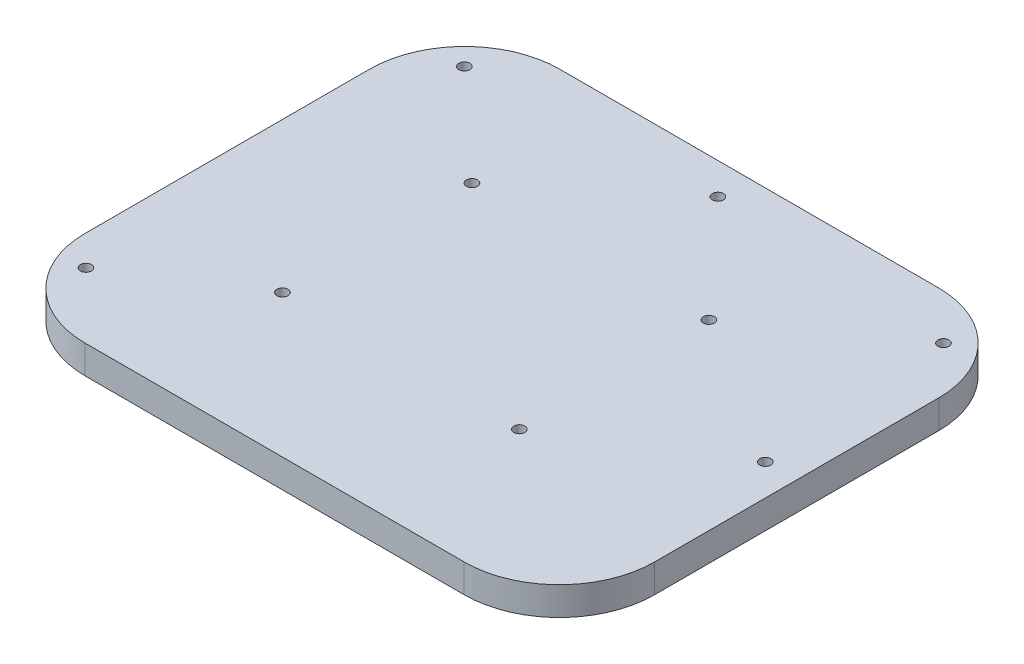
ISO-10303-21;
HEADER;
FILE_DESCRIPTION(('STEP AP214'),'2;1');
FILE_NAME('part.step','',(''),(''),'','','');
FILE_SCHEMA(('AUTOMOTIVE_DESIGN { 1 0 10303 214 1 1 1 1 }'));
ENDSEC;
DATA;
#1=APPLICATION_CONTEXT('core data for automotive mechanical design processes');
#2=APPLICATION_PROTOCOL_DEFINITION('international standard','automotive_design',2000,#1);
#3=PRODUCT_CONTEXT('',#1,'mechanical');
#4=PRODUCT('Part','Part','',(#3));
#5=PRODUCT_RELATED_PRODUCT_CATEGORY('part','',(#4));
#6=PRODUCT_DEFINITION_FORMATION('','',#4);
#7=PRODUCT_DEFINITION_CONTEXT('part definition',#1,'design');
#8=PRODUCT_DEFINITION('design','',#6,#7);
#9=PRODUCT_DEFINITION_SHAPE('','',#8);
#10=(LENGTH_UNIT() NAMED_UNIT(*) SI_UNIT(.MILLI.,.METRE.));
#11=(NAMED_UNIT(*) PLANE_ANGLE_UNIT() SI_UNIT($,.RADIAN.));
#12=(NAMED_UNIT(*) SI_UNIT($,.STERADIAN.) SOLID_ANGLE_UNIT());
#13=UNCERTAINTY_MEASURE_WITH_UNIT(LENGTH_MEASURE(1.E-05),#10,'distance_accuracy_value','');
#14=(GEOMETRIC_REPRESENTATION_CONTEXT(3) GLOBAL_UNCERTAINTY_ASSIGNED_CONTEXT((#13)) GLOBAL_UNIT_ASSIGNED_CONTEXT((#10,
#11,#12)) REPRESENTATION_CONTEXT('',''));
#15=CARTESIAN_POINT('',(0.,0.,0.));
#16=DIRECTION('',(0.,0.,1.));
#17=DIRECTION('',(1.,0.,0.));
#18=AXIS2_PLACEMENT_3D('',#15,#16,#17);
#19=CARTESIAN_POINT('',(-40.,6.,-30.));
#20=DIRECTION('',(0.,-1.,0.));
#21=DIRECTION('',(0.,0.,-1.));
#22=AXIS2_PLACEMENT_3D('',#19,#20,#21);
#23=CYLINDRICAL_SURFACE('',#22,20.08);
#24=CARTESIAN_POINT('',(-40.,0.,-30.));
#25=DIRECTION('',(0.,1.,0.));
#26=DIRECTION('',(0.,0.,1.));
#27=AXIS2_PLACEMENT_3D('',#24,#25,#26);
#28=CIRCLE('',#27,20.08);
#29=CARTESIAN_POINT('',(-40.,0.,-50.08));
#30=VERTEX_POINT('',#29);
#31=CARTESIAN_POINT('',(-60.08,0.,-30.));
#32=VERTEX_POINT('',#31);
#33=EDGE_CURVE('E135',#30,#32,#28,.T.);
#34=ORIENTED_EDGE('',*,*,#33,.T.);
#35=DIRECTION('',(0.,1.,0.));
#36=VECTOR('',#35,1.);
#37=CARTESIAN_POINT('',(-60.08,6.,-30.));
#38=LINE('',#37,#36);
#39=CARTESIAN_POINT('',(-60.08,6.,-30.));
#40=VERTEX_POINT('',#39);
#41=EDGE_CURVE('E12',#40,#32,#38,.F.);
#42=ORIENTED_EDGE('',*,*,#41,.F.);
#43=CARTESIAN_POINT('',(-40.,6.,-30.));
#44=DIRECTION('',(0.,1.,0.));
#45=DIRECTION('',(0.,0.,1.));
#46=AXIS2_PLACEMENT_3D('',#43,#44,#45);
#47=CIRCLE('',#46,20.08);
#48=CARTESIAN_POINT('',(-40.,6.,-50.08));
#49=VERTEX_POINT('',#48);
#50=EDGE_CURVE('E141',#49,#40,#47,.T.);
#51=ORIENTED_EDGE('',*,*,#50,.F.);
#52=DIRECTION('',(0.,-1.,0.));
#53=VECTOR('',#52,1.);
#54=CARTESIAN_POINT('',(-40.,6.,-50.08));
#55=LINE('',#54,#53);
#56=EDGE_CURVE('E149',#49,#30,#55,.T.);
#57=ORIENTED_EDGE('',*,*,#56,.T.);
#58=EDGE_LOOP('',(#34,#42,#51,#57));
#59=FACE_BOUND('',#58,.T.);
#60=ADVANCED_FACE('F33',(#59),#23,.T.);
#61=CARTESIAN_POINT('',(-60.08,6.,-30.));
#62=DIRECTION('',(1.,0.,0.));
#63=DIRECTION('',(0.,0.,-1.));
#64=AXIS2_PLACEMENT_3D('',#61,#62,#63);
#65=PLANE('',#64);
#66=DIRECTION('',(0.,0.,1.));
#67=VECTOR('',#66,1.);
#68=CARTESIAN_POINT('',(-60.08,0.,-30.));
#69=LINE('',#68,#67);
#70=CARTESIAN_POINT('',(-60.08,0.,30.));
#71=VERTEX_POINT('',#70);
#72=EDGE_CURVE('E133',#32,#71,#69,.T.);
#73=ORIENTED_EDGE('',*,*,#72,.T.);
#74=DIRECTION('',(0.,-1.,0.));
#75=VECTOR('',#74,1.);
#76=CARTESIAN_POINT('',(-60.08,6.,30.));
#77=LINE('',#76,#75);
#78=CARTESIAN_POINT('',(-60.08,6.,30.));
#79=VERTEX_POINT('',#78);
#80=EDGE_CURVE('E43',#79,#71,#77,.T.);
#81=ORIENTED_EDGE('',*,*,#80,.F.);
#82=DIRECTION('',(0.,0.,1.));
#83=VECTOR('',#82,1.);
#84=CARTESIAN_POINT('',(-60.08,6.,-30.));
#85=LINE('',#84,#83);
#86=EDGE_CURVE('E151',#40,#79,#85,.T.);
#87=ORIENTED_EDGE('',*,*,#86,.F.);
#88=ORIENTED_EDGE('',*,*,#41,.T.);
#89=EDGE_LOOP('',(#73,#81,#87,#88));
#90=FACE_BOUND('',#89,.T.);
#91=ADVANCED_FACE('F158',(#90),#65,.F.);
#92=CARTESIAN_POINT('',(-40.,6.,30.));
#93=DIRECTION('',(0.,-1.,0.));
#94=DIRECTION('',(0.,0.,-1.));
#95=AXIS2_PLACEMENT_3D('',#92,#93,#94);
#96=CYLINDRICAL_SURFACE('',#95,20.08);
#97=CARTESIAN_POINT('',(-40.,0.,30.));
#98=DIRECTION('',(0.,1.,0.));
#99=DIRECTION('',(0.,0.,1.));
#100=AXIS2_PLACEMENT_3D('',#97,#98,#99);
#101=CIRCLE('',#100,20.08);
#102=CARTESIAN_POINT('',(-40.,0.,50.08));
#103=VERTEX_POINT('',#102);
#104=EDGE_CURVE('E114',#71,#103,#101,.T.);
#105=ORIENTED_EDGE('',*,*,#104,.T.);
#106=DIRECTION('',(0.,1.,0.));
#107=VECTOR('',#106,1.);
#108=CARTESIAN_POINT('',(-40.,6.,50.08));
#109=LINE('',#108,#107);
#110=CARTESIAN_POINT('',(-40.,6.,50.08));
#111=VERTEX_POINT('',#110);
#112=EDGE_CURVE('E109',#111,#103,#109,.F.);
#113=ORIENTED_EDGE('',*,*,#112,.F.);
#114=CARTESIAN_POINT('',(-40.,6.,30.));
#115=DIRECTION('',(0.,1.,0.));
#116=DIRECTION('',(0.,0.,1.));
#117=AXIS2_PLACEMENT_3D('',#114,#115,#116);
#118=CIRCLE('',#117,20.08);
#119=EDGE_CURVE('E68',#79,#111,#118,.T.);
#120=ORIENTED_EDGE('',*,*,#119,.F.);
#121=ORIENTED_EDGE('',*,*,#80,.T.);
#122=EDGE_LOOP('',(#105,#113,#120,#121));
#123=FACE_BOUND('',#122,.T.);
#124=ADVANCED_FACE('F160',(#123),#96,.T.);
#125=CARTESIAN_POINT('',(-40.,6.,50.08));
#126=DIRECTION('',(0.,0.,-1.));
#127=DIRECTION('',(-1.,0.,0.));
#128=AXIS2_PLACEMENT_3D('',#125,#126,#127);
#129=PLANE('',#128);
#130=DIRECTION('',(1.,0.,0.));
#131=VECTOR('',#130,1.);
#132=CARTESIAN_POINT('',(-40.,0.,50.08));
#133=LINE('',#132,#131);
#134=CARTESIAN_POINT('',(40.,0.,50.08));
#135=VERTEX_POINT('',#134);
#136=EDGE_CURVE('E105',#103,#135,#133,.T.);
#137=ORIENTED_EDGE('',*,*,#136,.T.);
#138=DIRECTION('',(0.,-1.,0.));
#139=VECTOR('',#138,1.);
#140=CARTESIAN_POINT('',(40.,6.,50.08));
#141=LINE('',#140,#139);
#142=CARTESIAN_POINT('',(40.,6.,50.08));
#143=VERTEX_POINT('',#142);
#144=EDGE_CURVE('E108',#143,#135,#141,.T.);
#145=ORIENTED_EDGE('',*,*,#144,.F.);
#146=DIRECTION('',(1.,0.,0.));
#147=VECTOR('',#146,1.);
#148=CARTESIAN_POINT('',(-40.,6.,50.08));
#149=LINE('',#148,#147);
#150=EDGE_CURVE('E37',#111,#143,#149,.T.);
#151=ORIENTED_EDGE('',*,*,#150,.F.);
#152=ORIENTED_EDGE('',*,*,#112,.T.);
#153=EDGE_LOOP('',(#137,#145,#151,#152));
#154=FACE_BOUND('',#153,.T.);
#155=ADVANCED_FACE('F107',(#154),#129,.F.);
#156=CARTESIAN_POINT('',(40.,6.,30.));
#157=DIRECTION('',(0.,-1.,0.));
#158=DIRECTION('',(0.,0.,-1.));
#159=AXIS2_PLACEMENT_3D('',#156,#157,#158);
#160=CYLINDRICAL_SURFACE('',#159,20.08);
#161=CARTESIAN_POINT('',(40.,0.,30.));
#162=DIRECTION('',(0.,1.,0.));
#163=DIRECTION('',(0.,0.,1.));
#164=AXIS2_PLACEMENT_3D('',#161,#162,#163);
#165=CIRCLE('',#164,20.08);
#166=CARTESIAN_POINT('',(60.08,0.,30.));
#167=VERTEX_POINT('',#166);
#168=EDGE_CURVE('E113',#135,#167,#165,.T.);
#169=ORIENTED_EDGE('',*,*,#168,.T.);
#170=DIRECTION('',(0.,1.,0.));
#171=VECTOR('',#170,1.);
#172=CARTESIAN_POINT('',(60.08,6.,30.));
#173=LINE('',#172,#171);
#174=CARTESIAN_POINT('',(60.08,6.,30.));
#175=VERTEX_POINT('',#174);
#176=EDGE_CURVE('E119',#175,#167,#173,.F.);
#177=ORIENTED_EDGE('',*,*,#176,.F.);
#178=CARTESIAN_POINT('',(40.,6.,30.));
#179=DIRECTION('',(0.,1.,0.));
#180=DIRECTION('',(0.,0.,1.));
#181=AXIS2_PLACEMENT_3D('',#178,#179,#180);
#182=CIRCLE('',#181,20.08);
#183=EDGE_CURVE('E77',#143,#175,#182,.T.);
#184=ORIENTED_EDGE('',*,*,#183,.F.);
#185=ORIENTED_EDGE('',*,*,#144,.T.);
#186=EDGE_LOOP('',(#169,#177,#184,#185));
#187=FACE_BOUND('',#186,.T.);
#188=ADVANCED_FACE('F117',(#187),#160,.T.);
#189=CARTESIAN_POINT('',(60.08,6.,-30.));
#190=DIRECTION('',(-1.,0.,0.));
#191=DIRECTION('',(0.,0.,1.));
#192=AXIS2_PLACEMENT_3D('',#189,#190,#191);
#193=PLANE('',#192);
#194=DIRECTION('',(0.,0.,-1.));
#195=VECTOR('',#194,1.);
#196=CARTESIAN_POINT('',(60.08,0.,-30.));
#197=LINE('',#196,#195);
#198=CARTESIAN_POINT('',(60.08,0.,-30.));
#199=VERTEX_POINT('',#198);
#200=EDGE_CURVE('E125',#167,#199,#197,.T.);
#201=ORIENTED_EDGE('',*,*,#200,.T.);
#202=DIRECTION('',(0.,-1.,0.));
#203=VECTOR('',#202,1.);
#204=CARTESIAN_POINT('',(60.08,6.,-30.));
#205=LINE('',#204,#203);
#206=CARTESIAN_POINT('',(60.08,6.,-30.));
#207=VERTEX_POINT('',#206);
#208=EDGE_CURVE('E168',#207,#199,#205,.T.);
#209=ORIENTED_EDGE('',*,*,#208,.F.);
#210=DIRECTION('',(0.,0.,-1.));
#211=VECTOR('',#210,1.);
#212=CARTESIAN_POINT('',(60.08,6.,-30.));
#213=LINE('',#212,#211);
#214=EDGE_CURVE('E144',#175,#207,#213,.T.);
#215=ORIENTED_EDGE('',*,*,#214,.F.);
#216=ORIENTED_EDGE('',*,*,#176,.T.);
#217=EDGE_LOOP('',(#201,#209,#215,#216));
#218=FACE_BOUND('',#217,.T.);
#219=ADVANCED_FACE('F285',(#218),#193,.F.);
#220=CARTESIAN_POINT('',(40.,6.,-30.));
#221=DIRECTION('',(0.,-1.,0.));
#222=DIRECTION('',(0.,0.,-1.));
#223=AXIS2_PLACEMENT_3D('',#220,#221,#222);
#224=CYLINDRICAL_SURFACE('',#223,20.08);
#225=CARTESIAN_POINT('',(40.,0.,-30.));
#226=DIRECTION('',(0.,1.,0.));
#227=DIRECTION('',(0.,0.,1.));
#228=AXIS2_PLACEMENT_3D('',#225,#226,#227);
#229=CIRCLE('',#228,20.08);
#230=CARTESIAN_POINT('',(40.,0.,-50.08));
#231=VERTEX_POINT('',#230);
#232=EDGE_CURVE('E127',#199,#231,#229,.T.);
#233=ORIENTED_EDGE('',*,*,#232,.T.);
#234=DIRECTION('',(0.,1.,0.));
#235=VECTOR('',#234,1.);
#236=CARTESIAN_POINT('',(40.,6.,-50.08));
#237=LINE('',#236,#235);
#238=CARTESIAN_POINT('',(40.,6.,-50.08));
#239=VERTEX_POINT('',#238);
#240=EDGE_CURVE('E165',#239,#231,#237,.F.);
#241=ORIENTED_EDGE('',*,*,#240,.F.);
#242=CARTESIAN_POINT('',(40.,6.,-30.));
#243=DIRECTION('',(0.,1.,0.));
#244=DIRECTION('',(0.,0.,1.));
#245=AXIS2_PLACEMENT_3D('',#242,#243,#244);
#246=CIRCLE('',#245,20.08);
#247=EDGE_CURVE('E146',#207,#239,#246,.T.);
#248=ORIENTED_EDGE('',*,*,#247,.F.);
#249=ORIENTED_EDGE('',*,*,#208,.T.);
#250=EDGE_LOOP('',(#233,#241,#248,#249));
#251=FACE_BOUND('',#250,.T.);
#252=ADVANCED_FACE('F290',(#251),#224,.T.);
#253=CARTESIAN_POINT('',(-40.,6.,-50.08));
#254=DIRECTION('',(0.,0.,1.));
#255=DIRECTION('',(1.,0.,0.));
#256=AXIS2_PLACEMENT_3D('',#253,#254,#255);
#257=PLANE('',#256);
#258=DIRECTION('',(-1.,0.,0.));
#259=VECTOR('',#258,1.);
#260=CARTESIAN_POINT('',(-40.,0.,-50.08));
#261=LINE('',#260,#259);
#262=EDGE_CURVE('E139',#231,#30,#261,.T.);
#263=ORIENTED_EDGE('',*,*,#262,.T.);
#264=ORIENTED_EDGE('',*,*,#56,.F.);
#265=DIRECTION('',(-1.,0.,0.));
#266=VECTOR('',#265,1.);
#267=CARTESIAN_POINT('',(-40.,6.,-50.08));
#268=LINE('',#267,#266);
#269=EDGE_CURVE('E52',#239,#49,#268,.T.);
#270=ORIENTED_EDGE('',*,*,#269,.F.);
#271=ORIENTED_EDGE('',*,*,#240,.T.);
#272=EDGE_LOOP('',(#263,#264,#270,#271));
#273=FACE_BOUND('',#272,.T.);
#274=ADVANCED_FACE('F238',(#273),#257,.F.);
#275=CARTESIAN_POINT('',(-40.,6.,-30.));
#276=DIRECTION('',(0.,1.,0.));
#277=DIRECTION('',(0.,0.,1.));
#278=AXIS2_PLACEMENT_3D('',#275,#276,#277);
#279=PLANE('',#278);
#280=CARTESIAN_POINT('',(21.55,6.,20.));
#281=DIRECTION('',(0.,1.,0.));
#282=DIRECTION('',(0.,0.,1.));
#283=AXIS2_PLACEMENT_3D('',#280,#281,#282);
#284=CIRCLE('',#283,1.17);
#285=CARTESIAN_POINT('',(21.55,6.,21.17));
#286=VERTEX_POINT('',#285);
#287=EDGE_CURVE('E222',#286,#286,#284,.T.);
#288=ORIENTED_EDGE('',*,*,#287,.F.);
#289=EDGE_LOOP('',(#288));
#290=FACE_BOUND('',#289,.T.);
#291=CARTESIAN_POINT('',(-28.45,6.,20.));
#292=DIRECTION('',(0.,1.,0.));
#293=DIRECTION('',(0.,0.,1.));
#294=AXIS2_PLACEMENT_3D('',#291,#292,#293);
#295=CIRCLE('',#294,1.17);
#296=CARTESIAN_POINT('',(-28.45,6.,21.17));
#297=VERTEX_POINT('',#296);
#298=EDGE_CURVE('E216',#297,#297,#295,.T.);
#299=ORIENTED_EDGE('',*,*,#298,.F.);
#300=EDGE_LOOP('',(#299));
#301=FACE_BOUND('',#300,.T.);
#302=CARTESIAN_POINT('',(21.55,6.,-20.));
#303=DIRECTION('',(0.,1.,0.));
#304=DIRECTION('',(0.,0.,1.));
#305=AXIS2_PLACEMENT_3D('',#302,#303,#304);
#306=CIRCLE('',#305,1.17);
#307=CARTESIAN_POINT('',(21.55,6.,-18.83));
#308=VERTEX_POINT('',#307);
#309=EDGE_CURVE('E210',#308,#308,#306,.T.);
#310=ORIENTED_EDGE('',*,*,#309,.F.);
#311=EDGE_LOOP('',(#310));
#312=FACE_BOUND('',#311,.T.);
#313=CARTESIAN_POINT('',(-28.45,6.,-20.));
#314=DIRECTION('',(0.,1.,0.));
#315=DIRECTION('',(0.,0.,1.));
#316=AXIS2_PLACEMENT_3D('',#313,#314,#315);
#317=CIRCLE('',#316,1.17);
#318=CARTESIAN_POINT('',(-28.45,6.,-18.83));
#319=VERTEX_POINT('',#318);
#320=EDGE_CURVE('E204',#319,#319,#317,.T.);
#321=ORIENTED_EDGE('',*,*,#320,.F.);
#322=EDGE_LOOP('',(#321));
#323=FACE_BOUND('',#322,.T.);
#324=CARTESIAN_POINT('',(-53.7092926056018,6.,36.2273752960606));
#325=DIRECTION('',(0.,1.,0.));
#326=DIRECTION('',(0.,0.,1.));
#327=AXIS2_PLACEMENT_3D('',#324,#325,#326);
#328=CIRCLE('',#327,1.17);
#329=CARTESIAN_POINT('',(-53.7092926056018,6.,37.3973752960606));
#330=VERTEX_POINT('',#329);
#331=EDGE_CURVE('E198',#330,#330,#328,.T.);
#332=ORIENTED_EDGE('',*,*,#331,.F.);
#333=EDGE_LOOP('',(#332));
#334=FACE_BOUND('',#333,.T.);
#335=CARTESIAN_POINT('',(-50.5585567633134,6.,-40.5085567633135));
#336=DIRECTION('',(0.,1.,0.));
#337=DIRECTION('',(0.,0.,1.));
#338=AXIS2_PLACEMENT_3D('',#335,#336,#337);
#339=CIRCLE('',#338,1.17);
#340=CARTESIAN_POINT('',(-50.5585567633134,6.,-39.3385567633135));
#341=VERTEX_POINT('',#340);
#342=EDGE_CURVE('E192',#341,#341,#339,.T.);
#343=ORIENTED_EDGE('',*,*,#342,.F.);
#344=EDGE_LOOP('',(#343));
#345=FACE_BOUND('',#344,.T.);
#346=CARTESIAN_POINT('',(50.5602719269526,6.,-40.5064159820192));
#347=DIRECTION('',(0.,1.,0.));
#348=DIRECTION('',(0.,0.,1.));
#349=AXIS2_PLACEMENT_3D('',#346,#347,#348);
#350=CIRCLE('',#349,1.17);
#351=CARTESIAN_POINT('',(50.5602719269526,6.,-39.3364159820192));
#352=VERTEX_POINT('',#351);
#353=EDGE_CURVE('E186',#352,#352,#350,.T.);
#354=ORIENTED_EDGE('',*,*,#353,.F.);
#355=EDGE_LOOP('',(#354));
#356=FACE_BOUND('',#355,.T.);
#357=CARTESIAN_POINT('',(0.,6.,-43.45));
#358=DIRECTION('',(0.,1.,0.));
#359=DIRECTION('',(0.,0.,1.));
#360=AXIS2_PLACEMENT_3D('',#357,#358,#359);
#361=CIRCLE('',#360,1.17);
#362=CARTESIAN_POINT('',(0.,6.,-42.28));
#363=VERTEX_POINT('',#362);
#364=EDGE_CURVE('E180',#363,#363,#361,.T.);
#365=ORIENTED_EDGE('',*,*,#364,.F.);
#366=EDGE_LOOP('',(#365));
#367=FACE_BOUND('',#366,.T.);
#368=CARTESIAN_POINT('',(53.475,6.,0.));
#369=DIRECTION('',(0.,1.,0.));
#370=DIRECTION('',(0.,0.,1.));
#371=AXIS2_PLACEMENT_3D('',#368,#369,#370);
#372=CIRCLE('',#371,1.17);
#373=CARTESIAN_POINT('',(53.475,6.,1.17));
#374=VERTEX_POINT('',#373);
#375=EDGE_CURVE('E174',#374,#374,#372,.T.);
#376=ORIENTED_EDGE('',*,*,#375,.F.);
#377=EDGE_LOOP('',(#376));
#378=FACE_BOUND('',#377,.T.);
#379=ORIENTED_EDGE('',*,*,#50,.T.);
#380=ORIENTED_EDGE('',*,*,#86,.T.);
#381=ORIENTED_EDGE('',*,*,#119,.T.);
#382=ORIENTED_EDGE('',*,*,#150,.T.);
#383=ORIENTED_EDGE('',*,*,#183,.T.);
#384=ORIENTED_EDGE('',*,*,#214,.T.);
#385=ORIENTED_EDGE('',*,*,#247,.T.);
#386=ORIENTED_EDGE('',*,*,#269,.T.);
#387=EDGE_LOOP('',(#379,#380,#381,#382,#383,#384,#385,#386));
#388=FACE_BOUND('',#387,.T.);
#389=ADVANCED_FACE('F153',(#290,#301,#312,#323,#334,#345,#356,#367,#378,#388),#279,.T.);
#390=CARTESIAN_POINT('',(-40.,0.,-30.));
#391=DIRECTION('',(0.,1.,0.));
#392=DIRECTION('',(0.,0.,1.));
#393=AXIS2_PLACEMENT_3D('',#390,#391,#392);
#394=PLANE('',#393);
#395=CARTESIAN_POINT('',(21.55,0.,20.));
#396=DIRECTION('',(0.,1.,0.));
#397=DIRECTION('',(0.,0.,1.));
#398=AXIS2_PLACEMENT_3D('',#395,#396,#397);
#399=CIRCLE('',#398,1.17);
#400=CARTESIAN_POINT('',(21.55,0.,21.17));
#401=VERTEX_POINT('',#400);
#402=EDGE_CURVE('E219',#401,#401,#399,.T.);
#403=ORIENTED_EDGE('',*,*,#402,.T.);
#404=EDGE_LOOP('',(#403));
#405=FACE_BOUND('',#404,.T.);
#406=CARTESIAN_POINT('',(-28.45,0.,20.));
#407=DIRECTION('',(0.,1.,0.));
#408=DIRECTION('',(0.,0.,1.));
#409=AXIS2_PLACEMENT_3D('',#406,#407,#408);
#410=CIRCLE('',#409,1.17);
#411=CARTESIAN_POINT('',(-28.45,0.,21.17));
#412=VERTEX_POINT('',#411);
#413=EDGE_CURVE('E213',#412,#412,#410,.T.);
#414=ORIENTED_EDGE('',*,*,#413,.T.);
#415=EDGE_LOOP('',(#414));
#416=FACE_BOUND('',#415,.T.);
#417=CARTESIAN_POINT('',(21.55,0.,-20.));
#418=DIRECTION('',(0.,1.,0.));
#419=DIRECTION('',(0.,0.,1.));
#420=AXIS2_PLACEMENT_3D('',#417,#418,#419);
#421=CIRCLE('',#420,1.17);
#422=CARTESIAN_POINT('',(21.55,0.,-18.83));
#423=VERTEX_POINT('',#422);
#424=EDGE_CURVE('E207',#423,#423,#421,.T.);
#425=ORIENTED_EDGE('',*,*,#424,.T.);
#426=EDGE_LOOP('',(#425));
#427=FACE_BOUND('',#426,.T.);
#428=CARTESIAN_POINT('',(-28.45,0.,-20.));
#429=DIRECTION('',(0.,1.,0.));
#430=DIRECTION('',(0.,0.,1.));
#431=AXIS2_PLACEMENT_3D('',#428,#429,#430);
#432=CIRCLE('',#431,1.17);
#433=CARTESIAN_POINT('',(-28.45,0.,-18.83));
#434=VERTEX_POINT('',#433);
#435=EDGE_CURVE('E201',#434,#434,#432,.T.);
#436=ORIENTED_EDGE('',*,*,#435,.T.);
#437=EDGE_LOOP('',(#436));
#438=FACE_BOUND('',#437,.T.);
#439=CARTESIAN_POINT('',(-53.7092926056018,0.,36.2273752960606));
#440=DIRECTION('',(0.,1.,0.));
#441=DIRECTION('',(0.,0.,1.));
#442=AXIS2_PLACEMENT_3D('',#439,#440,#441);
#443=CIRCLE('',#442,1.17);
#444=CARTESIAN_POINT('',(-53.7092926056018,0.,37.3973752960606));
#445=VERTEX_POINT('',#444);
#446=EDGE_CURVE('E195',#445,#445,#443,.T.);
#447=ORIENTED_EDGE('',*,*,#446,.T.);
#448=EDGE_LOOP('',(#447));
#449=FACE_BOUND('',#448,.T.);
#450=CARTESIAN_POINT('',(-50.5585567633134,0.,-40.5085567633135));
#451=DIRECTION('',(0.,1.,0.));
#452=DIRECTION('',(0.,0.,1.));
#453=AXIS2_PLACEMENT_3D('',#450,#451,#452);
#454=CIRCLE('',#453,1.17);
#455=CARTESIAN_POINT('',(-50.5585567633134,0.,-39.3385567633135));
#456=VERTEX_POINT('',#455);
#457=EDGE_CURVE('E189',#456,#456,#454,.T.);
#458=ORIENTED_EDGE('',*,*,#457,.T.);
#459=EDGE_LOOP('',(#458));
#460=FACE_BOUND('',#459,.T.);
#461=CARTESIAN_POINT('',(50.5602719269526,0.,-40.5064159820192));
#462=DIRECTION('',(0.,1.,0.));
#463=DIRECTION('',(0.,0.,1.));
#464=AXIS2_PLACEMENT_3D('',#461,#462,#463);
#465=CIRCLE('',#464,1.17);
#466=CARTESIAN_POINT('',(50.5602719269526,0.,-39.3364159820192));
#467=VERTEX_POINT('',#466);
#468=EDGE_CURVE('E183',#467,#467,#465,.T.);
#469=ORIENTED_EDGE('',*,*,#468,.T.);
#470=EDGE_LOOP('',(#469));
#471=FACE_BOUND('',#470,.T.);
#472=CARTESIAN_POINT('',(0.,0.,-43.45));
#473=DIRECTION('',(0.,1.,0.));
#474=DIRECTION('',(0.,0.,1.));
#475=AXIS2_PLACEMENT_3D('',#472,#473,#474);
#476=CIRCLE('',#475,1.17);
#477=CARTESIAN_POINT('',(0.,0.,-42.28));
#478=VERTEX_POINT('',#477);
#479=EDGE_CURVE('E177',#478,#478,#476,.T.);
#480=ORIENTED_EDGE('',*,*,#479,.T.);
#481=EDGE_LOOP('',(#480));
#482=FACE_BOUND('',#481,.T.);
#483=CARTESIAN_POINT('',(53.475,0.,0.));
#484=DIRECTION('',(0.,1.,0.));
#485=DIRECTION('',(0.,0.,1.));
#486=AXIS2_PLACEMENT_3D('',#483,#484,#485);
#487=CIRCLE('',#486,1.17);
#488=CARTESIAN_POINT('',(53.475,0.,1.17));
#489=VERTEX_POINT('',#488);
#490=EDGE_CURVE('E138',#489,#489,#487,.T.);
#491=ORIENTED_EDGE('',*,*,#490,.T.);
#492=EDGE_LOOP('',(#491));
#493=FACE_BOUND('',#492,.T.);
#494=ORIENTED_EDGE('',*,*,#33,.F.);
#495=ORIENTED_EDGE('',*,*,#262,.F.);
#496=ORIENTED_EDGE('',*,*,#232,.F.);
#497=ORIENTED_EDGE('',*,*,#200,.F.);
#498=ORIENTED_EDGE('',*,*,#168,.F.);
#499=ORIENTED_EDGE('',*,*,#136,.F.);
#500=ORIENTED_EDGE('',*,*,#104,.F.);
#501=ORIENTED_EDGE('',*,*,#72,.F.);
#502=EDGE_LOOP('',(#494,#495,#496,#497,#498,#499,#500,#501));
#503=FACE_BOUND('',#502,.T.);
#504=ADVANCED_FACE('F123',(#405,#416,#427,#438,#449,#460,#471,#482,#493,#503),#394,.F.);
#505=CARTESIAN_POINT('',(53.475,0.,0.));
#506=DIRECTION('',(0.,1.,0.));
#507=DIRECTION('',(0.,0.,1.));
#508=AXIS2_PLACEMENT_3D('',#505,#506,#507);
#509=CYLINDRICAL_SURFACE('',#508,1.17);
#510=ORIENTED_EDGE('',*,*,#490,.F.);
#511=EDGE_LOOP('',(#510));
#512=FACE_BOUND('',#511,.T.);
#513=ORIENTED_EDGE('',*,*,#375,.T.);
#514=EDGE_LOOP('',(#513));
#515=FACE_BOUND('',#514,.T.);
#516=ADVANCED_FACE('F256',(#512,#515),#509,.F.);
#517=CARTESIAN_POINT('',(0.,0.,-43.45));
#518=DIRECTION('',(0.,1.,0.));
#519=DIRECTION('',(0.,0.,1.));
#520=AXIS2_PLACEMENT_3D('',#517,#518,#519);
#521=CYLINDRICAL_SURFACE('',#520,1.17);
#522=ORIENTED_EDGE('',*,*,#479,.F.);
#523=EDGE_LOOP('',(#522));
#524=FACE_BOUND('',#523,.T.);
#525=ORIENTED_EDGE('',*,*,#364,.T.);
#526=EDGE_LOOP('',(#525));
#527=FACE_BOUND('',#526,.T.);
#528=ADVANCED_FACE('F258',(#524,#527),#521,.F.);
#529=CARTESIAN_POINT('',(50.5602719269526,0.,-40.5064159820192));
#530=DIRECTION('',(0.,1.,0.));
#531=DIRECTION('',(0.,0.,1.));
#532=AXIS2_PLACEMENT_3D('',#529,#530,#531);
#533=CYLINDRICAL_SURFACE('',#532,1.17);
#534=ORIENTED_EDGE('',*,*,#468,.F.);
#535=EDGE_LOOP('',(#534));
#536=FACE_BOUND('',#535,.T.);
#537=ORIENTED_EDGE('',*,*,#353,.T.);
#538=EDGE_LOOP('',(#537));
#539=FACE_BOUND('',#538,.T.);
#540=ADVANCED_FACE('F265',(#536,#539),#533,.F.);
#541=CARTESIAN_POINT('',(-50.5585567633134,0.,-40.5085567633135));
#542=DIRECTION('',(0.,1.,0.));
#543=DIRECTION('',(0.,0.,1.));
#544=AXIS2_PLACEMENT_3D('',#541,#542,#543);
#545=CYLINDRICAL_SURFACE('',#544,1.17);
#546=ORIENTED_EDGE('',*,*,#457,.F.);
#547=EDGE_LOOP('',(#546));
#548=FACE_BOUND('',#547,.T.);
#549=ORIENTED_EDGE('',*,*,#342,.T.);
#550=EDGE_LOOP('',(#549));
#551=FACE_BOUND('',#550,.T.);
#552=ADVANCED_FACE('F331',(#548,#551),#545,.F.);
#553=CARTESIAN_POINT('',(-53.7092926056018,0.,36.2273752960606));
#554=DIRECTION('',(0.,1.,0.));
#555=DIRECTION('',(0.,0.,1.));
#556=AXIS2_PLACEMENT_3D('',#553,#554,#555);
#557=CYLINDRICAL_SURFACE('',#556,1.17);
#558=ORIENTED_EDGE('',*,*,#446,.F.);
#559=EDGE_LOOP('',(#558));
#560=FACE_BOUND('',#559,.T.);
#561=ORIENTED_EDGE('',*,*,#331,.T.);
#562=EDGE_LOOP('',(#561));
#563=FACE_BOUND('',#562,.T.);
#564=ADVANCED_FACE('F341',(#560,#563),#557,.F.);
#565=CARTESIAN_POINT('',(-28.45,0.,-20.));
#566=DIRECTION('',(0.,1.,0.));
#567=DIRECTION('',(0.,0.,1.));
#568=AXIS2_PLACEMENT_3D('',#565,#566,#567);
#569=CYLINDRICAL_SURFACE('',#568,1.17);
#570=ORIENTED_EDGE('',*,*,#435,.F.);
#571=EDGE_LOOP('',(#570));
#572=FACE_BOUND('',#571,.T.);
#573=ORIENTED_EDGE('',*,*,#320,.T.);
#574=EDGE_LOOP('',(#573));
#575=FACE_BOUND('',#574,.T.);
#576=ADVANCED_FACE('F351',(#572,#575),#569,.F.);
#577=CARTESIAN_POINT('',(21.55,0.,-20.));
#578=DIRECTION('',(0.,1.,0.));
#579=DIRECTION('',(0.,0.,1.));
#580=AXIS2_PLACEMENT_3D('',#577,#578,#579);
#581=CYLINDRICAL_SURFACE('',#580,1.17);
#582=ORIENTED_EDGE('',*,*,#424,.F.);
#583=EDGE_LOOP('',(#582));
#584=FACE_BOUND('',#583,.T.);
#585=ORIENTED_EDGE('',*,*,#309,.T.);
#586=EDGE_LOOP('',(#585));
#587=FACE_BOUND('',#586,.T.);
#588=ADVANCED_FACE('F361',(#584,#587),#581,.F.);
#589=CARTESIAN_POINT('',(-28.45,0.,20.));
#590=DIRECTION('',(0.,1.,0.));
#591=DIRECTION('',(0.,0.,1.));
#592=AXIS2_PLACEMENT_3D('',#589,#590,#591);
#593=CYLINDRICAL_SURFACE('',#592,1.17);
#594=ORIENTED_EDGE('',*,*,#413,.F.);
#595=EDGE_LOOP('',(#594));
#596=FACE_BOUND('',#595,.T.);
#597=ORIENTED_EDGE('',*,*,#298,.T.);
#598=EDGE_LOOP('',(#597));
#599=FACE_BOUND('',#598,.T.);
#600=ADVANCED_FACE('F35',(#596,#599),#593,.F.);
#601=CARTESIAN_POINT('',(21.55,0.,20.));
#602=DIRECTION('',(0.,1.,0.));
#603=DIRECTION('',(0.,0.,1.));
#604=AXIS2_PLACEMENT_3D('',#601,#602,#603);
#605=CYLINDRICAL_SURFACE('',#604,1.17);
#606=ORIENTED_EDGE('',*,*,#402,.F.);
#607=EDGE_LOOP('',(#606));
#608=FACE_BOUND('',#607,.T.);
#609=ORIENTED_EDGE('',*,*,#287,.T.);
#610=EDGE_LOOP('',(#609));
#611=FACE_BOUND('',#610,.T.);
#612=ADVANCED_FACE('F230',(#608,#611),#605,.F.);
#613=CLOSED_SHELL('',(#60,#91,#124,#155,#188,#219,#252,#274,#389,#504,#516,#528,#540,#552,#564,
#576,#588,#600,#612));
#614=MANIFOLD_SOLID_BREP('B2',#613);
#615=ADVANCED_BREP_SHAPE_REPRESENTATION('',(#18,#614),#14);
#616=SHAPE_DEFINITION_REPRESENTATION(#9,#615);
ENDSEC;
END-ISO-10303-21;
